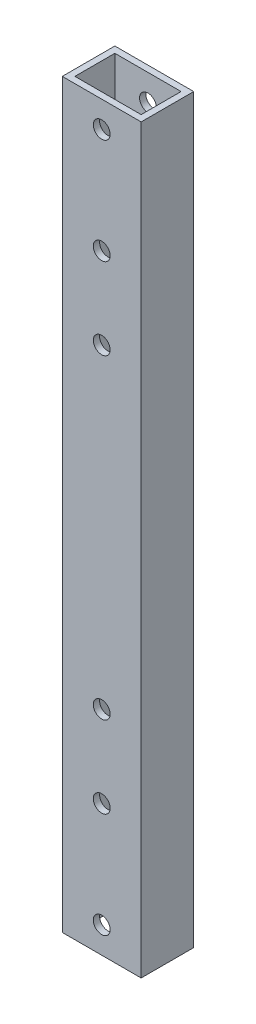
ISO-10303-21;
HEADER;
FILE_DESCRIPTION(('STEP AP214'),'2;1');
FILE_NAME('part.step','',(''),(''),'','','');
FILE_SCHEMA(('AUTOMOTIVE_DESIGN { 1 0 10303 214 1 1 1 1 }'));
ENDSEC;
DATA;
#1=APPLICATION_CONTEXT('core data for automotive mechanical design processes');
#2=APPLICATION_PROTOCOL_DEFINITION('international standard','automotive_design',2000,#1);
#3=PRODUCT_CONTEXT('',#1,'mechanical');
#4=PRODUCT('Part','Part','',(#3));
#5=PRODUCT_RELATED_PRODUCT_CATEGORY('part','',(#4));
#6=PRODUCT_DEFINITION_FORMATION('','',#4);
#7=PRODUCT_DEFINITION_CONTEXT('part definition',#1,'design');
#8=PRODUCT_DEFINITION('design','',#6,#7);
#9=PRODUCT_DEFINITION_SHAPE('','',#8);
#10=(LENGTH_UNIT() NAMED_UNIT(*) SI_UNIT(.MILLI.,.METRE.));
#11=(NAMED_UNIT(*) PLANE_ANGLE_UNIT() SI_UNIT($,.RADIAN.));
#12=(NAMED_UNIT(*) SI_UNIT($,.STERADIAN.) SOLID_ANGLE_UNIT());
#13=UNCERTAINTY_MEASURE_WITH_UNIT(LENGTH_MEASURE(1.E-05),#10,'distance_accuracy_value','');
#14=(GEOMETRIC_REPRESENTATION_CONTEXT(3) GLOBAL_UNCERTAINTY_ASSIGNED_CONTEXT((#13)) GLOBAL_UNIT_ASSIGNED_CONTEXT((#10,
#11,#12)) REPRESENTATION_CONTEXT('',''));
#15=CARTESIAN_POINT('',(0.,0.,0.));
#16=DIRECTION('',(0.,0.,1.));
#17=DIRECTION('',(1.,0.,0.));
#18=AXIS2_PLACEMENT_3D('',#15,#16,#17);
#19=CARTESIAN_POINT('',(0.,70.5,0.));
#20=DIRECTION('',(0.,1.,0.));
#21=DIRECTION('',(0.,0.,1.));
#22=AXIS2_PLACEMENT_3D('',#19,#20,#21);
#23=PLANE('',#22);
#24=DIRECTION('',(0.,0.,-1.));
#25=VECTOR('',#24,1.);
#26=CARTESIAN_POINT('',(7.5,70.5,-5.));
#27=LINE('',#26,#25);
#28=CARTESIAN_POINT('',(7.5,70.5,5.));
#29=VERTEX_POINT('',#28);
#30=CARTESIAN_POINT('',(7.5,70.5,-5.));
#31=VERTEX_POINT('',#30);
#32=EDGE_CURVE('E165',#29,#31,#27,.T.);
#33=ORIENTED_EDGE('',*,*,#32,.T.);
#34=DIRECTION('',(-1.,0.,0.));
#35=VECTOR('',#34,1.);
#36=CARTESIAN_POINT('',(-7.5,70.5,-5.));
#37=LINE('',#36,#35);
#38=CARTESIAN_POINT('',(-7.5,70.5,-5.));
#39=VERTEX_POINT('',#38);
#40=EDGE_CURVE('E169',#31,#39,#37,.T.);
#41=ORIENTED_EDGE('',*,*,#40,.T.);
#42=DIRECTION('',(0.,0.,1.));
#43=VECTOR('',#42,1.);
#44=CARTESIAN_POINT('',(-7.5,70.5,-5.));
#45=LINE('',#44,#43);
#46=CARTESIAN_POINT('',(-7.5,70.5,5.));
#47=VERTEX_POINT('',#46);
#48=EDGE_CURVE('E173',#39,#47,#45,.T.);
#49=ORIENTED_EDGE('',*,*,#48,.T.);
#50=DIRECTION('',(1.,0.,0.));
#51=VECTOR('',#50,1.);
#52=CARTESIAN_POINT('',(-7.5,70.5,5.));
#53=LINE('',#52,#51);
#54=EDGE_CURVE('E176',#47,#29,#53,.T.);
#55=ORIENTED_EDGE('',*,*,#54,.T.);
#56=EDGE_LOOP('',(#33,#41,#49,#55));
#57=FACE_BOUND('',#56,.T.);
#58=DIRECTION('',(1.,0.,0.));
#59=VECTOR('',#58,1.);
#60=CARTESIAN_POINT('',(-6.3,70.5,3.8));
#61=LINE('',#60,#59);
#62=CARTESIAN_POINT('',(-6.3,70.5,3.8));
#63=VERTEX_POINT('',#62);
#64=CARTESIAN_POINT('',(6.3,70.5,3.8));
#65=VERTEX_POINT('',#64);
#66=EDGE_CURVE('E124',#63,#65,#61,.T.);
#67=ORIENTED_EDGE('',*,*,#66,.F.);
#68=DIRECTION('',(0.,0.,1.));
#69=VECTOR('',#68,1.);
#70=CARTESIAN_POINT('',(-6.3,70.5,-3.8));
#71=LINE('',#70,#69);
#72=CARTESIAN_POINT('',(-6.3,70.5,-3.8));
#73=VERTEX_POINT('',#72);
#74=EDGE_CURVE('E115',#73,#63,#71,.T.);
#75=ORIENTED_EDGE('',*,*,#74,.F.);
#76=DIRECTION('',(-1.,0.,0.));
#77=VECTOR('',#76,1.);
#78=CARTESIAN_POINT('',(-6.3,70.5,-3.8));
#79=LINE('',#78,#77);
#80=CARTESIAN_POINT('',(6.3,70.5,-3.8));
#81=VERTEX_POINT('',#80);
#82=EDGE_CURVE('E141',#81,#73,#79,.T.);
#83=ORIENTED_EDGE('',*,*,#82,.F.);
#84=DIRECTION('',(0.,0.,-1.));
#85=VECTOR('',#84,1.);
#86=CARTESIAN_POINT('',(6.3,70.5,-3.8));
#87=LINE('',#86,#85);
#88=EDGE_CURVE('E137',#65,#81,#87,.T.);
#89=ORIENTED_EDGE('',*,*,#88,.F.);
#90=EDGE_LOOP('',(#67,#75,#83,#89));
#91=FACE_BOUND('',#90,.T.);
#92=ADVANCED_FACE('F47',(#57,#91),#23,.T.);
#93=CARTESIAN_POINT('',(0.,-70.5,0.));
#94=DIRECTION('',(0.,1.,0.));
#95=DIRECTION('',(0.,0.,1.));
#96=AXIS2_PLACEMENT_3D('',#93,#94,#95);
#97=PLANE('',#96);
#98=DIRECTION('',(0.,0.,-1.));
#99=VECTOR('',#98,1.);
#100=CARTESIAN_POINT('',(7.5,-70.5,-5.));
#101=LINE('',#100,#99);
#102=CARTESIAN_POINT('',(7.5,-70.5,5.));
#103=VERTEX_POINT('',#102);
#104=CARTESIAN_POINT('',(7.5,-70.5,-5.));
#105=VERTEX_POINT('',#104);
#106=EDGE_CURVE('E133',#103,#105,#101,.T.);
#107=ORIENTED_EDGE('',*,*,#106,.F.);
#108=DIRECTION('',(1.,0.,0.));
#109=VECTOR('',#108,1.);
#110=CARTESIAN_POINT('',(-7.5,-70.5,5.));
#111=LINE('',#110,#109);
#112=CARTESIAN_POINT('',(-7.5,-70.5,5.));
#113=VERTEX_POINT('',#112);
#114=EDGE_CURVE('E170',#113,#103,#111,.T.);
#115=ORIENTED_EDGE('',*,*,#114,.F.);
#116=DIRECTION('',(0.,0.,1.));
#117=VECTOR('',#116,1.);
#118=CARTESIAN_POINT('',(-7.5,-70.5,-5.));
#119=LINE('',#118,#117);
#120=CARTESIAN_POINT('',(-7.5,-70.5,-5.));
#121=VERTEX_POINT('',#120);
#122=EDGE_CURVE('E186',#121,#113,#119,.T.);
#123=ORIENTED_EDGE('',*,*,#122,.F.);
#124=DIRECTION('',(-1.,0.,0.));
#125=VECTOR('',#124,1.);
#126=CARTESIAN_POINT('',(-7.5,-70.5,-5.));
#127=LINE('',#126,#125);
#128=EDGE_CURVE('E183',#105,#121,#127,.T.);
#129=ORIENTED_EDGE('',*,*,#128,.F.);
#130=EDGE_LOOP('',(#107,#115,#123,#129));
#131=FACE_BOUND('',#130,.T.);
#132=DIRECTION('',(0.,0.,1.));
#133=VECTOR('',#132,1.);
#134=CARTESIAN_POINT('',(-6.3,-70.5,-3.8));
#135=LINE('',#134,#133);
#136=CARTESIAN_POINT('',(-6.3,-70.5,-3.8));
#137=VERTEX_POINT('',#136);
#138=CARTESIAN_POINT('',(-6.3,-70.5,3.8));
#139=VERTEX_POINT('',#138);
#140=EDGE_CURVE('E73',#137,#139,#135,.T.);
#141=ORIENTED_EDGE('',*,*,#140,.T.);
#142=DIRECTION('',(1.,0.,0.));
#143=VECTOR('',#142,1.);
#144=CARTESIAN_POINT('',(-6.3,-70.5,3.8));
#145=LINE('',#144,#143);
#146=CARTESIAN_POINT('',(6.3,-70.5,3.8));
#147=VERTEX_POINT('',#146);
#148=EDGE_CURVE('E131',#139,#147,#145,.T.);
#149=ORIENTED_EDGE('',*,*,#148,.T.);
#150=DIRECTION('',(0.,0.,-1.));
#151=VECTOR('',#150,1.);
#152=CARTESIAN_POINT('',(6.3,-70.5,-3.8));
#153=LINE('',#152,#151);
#154=CARTESIAN_POINT('',(6.3,-70.5,-3.8));
#155=VERTEX_POINT('',#154);
#156=EDGE_CURVE('E152',#147,#155,#153,.T.);
#157=ORIENTED_EDGE('',*,*,#156,.T.);
#158=DIRECTION('',(-1.,0.,0.));
#159=VECTOR('',#158,1.);
#160=CARTESIAN_POINT('',(-6.3,-70.5,-3.8));
#161=LINE('',#160,#159);
#162=EDGE_CURVE('E125',#155,#137,#161,.T.);
#163=ORIENTED_EDGE('',*,*,#162,.T.);
#164=EDGE_LOOP('',(#141,#149,#157,#163));
#165=FACE_BOUND('',#164,.T.);
#166=ADVANCED_FACE('F275',(#131,#165),#97,.F.);
#167=CARTESIAN_POINT('',(7.5,70.5,-5.));
#168=DIRECTION('',(-1.,0.,0.));
#169=DIRECTION('',(0.,0.,1.));
#170=AXIS2_PLACEMENT_3D('',#167,#168,#169);
#171=PLANE('',#170);
#172=ORIENTED_EDGE('',*,*,#106,.T.);
#173=DIRECTION('',(0.,-1.,0.));
#174=VECTOR('',#173,1.);
#175=CARTESIAN_POINT('',(7.5,70.5,-5.));
#176=LINE('',#175,#174);
#177=EDGE_CURVE('E11',#31,#105,#176,.T.);
#178=ORIENTED_EDGE('',*,*,#177,.F.);
#179=ORIENTED_EDGE('',*,*,#32,.F.);
#180=DIRECTION('',(0.,-1.,0.));
#181=VECTOR('',#180,1.);
#182=CARTESIAN_POINT('',(7.5,70.5,5.));
#183=LINE('',#182,#181);
#184=EDGE_CURVE('E179',#29,#103,#183,.T.);
#185=ORIENTED_EDGE('',*,*,#184,.T.);
#186=EDGE_LOOP('',(#172,#178,#179,#185));
#187=FACE_BOUND('',#186,.T.);
#188=ADVANCED_FACE('F49',(#187),#171,.F.);
#189=CARTESIAN_POINT('',(-7.5,70.5,-5.));
#190=DIRECTION('',(0.,0.,1.));
#191=DIRECTION('',(1.,0.,0.));
#192=AXIS2_PLACEMENT_3D('',#189,#190,#191);
#193=PLANE('',#192);
#194=CARTESIAN_POINT('',(0.,-65.5,-5.));
#195=DIRECTION('',(0.,0.,-1.));
#196=DIRECTION('',(-1.,0.,0.));
#197=AXIS2_PLACEMENT_3D('',#194,#195,#196);
#198=CIRCLE('',#197,1.60000000000001);
#199=CARTESIAN_POINT('',(-1.60000000000001,-65.5,-5.));
#200=VERTEX_POINT('',#199);
#201=EDGE_CURVE('E206',#200,#200,#198,.T.);
#202=ORIENTED_EDGE('',*,*,#201,.F.);
#203=EDGE_LOOP('',(#202));
#204=FACE_BOUND('',#203,.T.);
#205=CARTESIAN_POINT('',(0.,30.,-5.));
#206=DIRECTION('',(0.,0.,-1.));
#207=DIRECTION('',(1.,0.,0.));
#208=AXIS2_PLACEMENT_3D('',#205,#206,#207);
#209=CIRCLE('',#208,1.6);
#210=CARTESIAN_POINT('',(1.6,30.,-5.));
#211=VERTEX_POINT('',#210);
#212=EDGE_CURVE('E305',#211,#211,#209,.T.);
#213=ORIENTED_EDGE('',*,*,#212,.F.);
#214=EDGE_LOOP('',(#213));
#215=FACE_BOUND('',#214,.T.);
#216=CARTESIAN_POINT('',(0.,-45.5,-5.));
#217=DIRECTION('',(0.,0.,-1.));
#218=DIRECTION('',(-1.,0.,0.));
#219=AXIS2_PLACEMENT_3D('',#216,#217,#218);
#220=CIRCLE('',#219,1.6);
#221=CARTESIAN_POINT('',(-1.6,-45.5,-5.));
#222=VERTEX_POINT('',#221);
#223=EDGE_CURVE('E309',#222,#222,#220,.T.);
#224=ORIENTED_EDGE('',*,*,#223,.F.);
#225=EDGE_LOOP('',(#224));
#226=FACE_BOUND('',#225,.T.);
#227=CARTESIAN_POINT('',(0.,45.5,-5.));
#228=DIRECTION('',(0.,0.,-1.));
#229=DIRECTION('',(1.,0.,0.));
#230=AXIS2_PLACEMENT_3D('',#227,#228,#229);
#231=CIRCLE('',#230,1.6);
#232=CARTESIAN_POINT('',(1.59999999999999,45.5,-5.));
#233=VERTEX_POINT('',#232);
#234=EDGE_CURVE('E313',#233,#233,#231,.T.);
#235=ORIENTED_EDGE('',*,*,#234,.F.);
#236=EDGE_LOOP('',(#235));
#237=FACE_BOUND('',#236,.T.);
#238=CARTESIAN_POINT('',(0.,65.5,-5.));
#239=DIRECTION('',(0.,0.,-1.));
#240=DIRECTION('',(1.,0.,0.));
#241=AXIS2_PLACEMENT_3D('',#238,#239,#240);
#242=CIRCLE('',#241,1.60000000000001);
#243=CARTESIAN_POINT('',(1.6,65.5,-5.));
#244=VERTEX_POINT('',#243);
#245=EDGE_CURVE('E317',#244,#244,#242,.T.);
#246=ORIENTED_EDGE('',*,*,#245,.F.);
#247=EDGE_LOOP('',(#246));
#248=FACE_BOUND('',#247,.T.);
#249=CARTESIAN_POINT('',(0.,-30.,-5.));
#250=DIRECTION('',(0.,0.,-1.));
#251=DIRECTION('',(-1.,0.,0.));
#252=AXIS2_PLACEMENT_3D('',#249,#250,#251);
#253=CIRCLE('',#252,1.6);
#254=CARTESIAN_POINT('',(-1.6,-30.,-5.));
#255=VERTEX_POINT('',#254);
#256=EDGE_CURVE('E321',#255,#255,#253,.T.);
#257=ORIENTED_EDGE('',*,*,#256,.F.);
#258=EDGE_LOOP('',(#257));
#259=FACE_BOUND('',#258,.T.);
#260=ORIENTED_EDGE('',*,*,#128,.T.);
#261=DIRECTION('',(0.,-1.,0.));
#262=VECTOR('',#261,1.);
#263=CARTESIAN_POINT('',(-7.5,70.5,-5.));
#264=LINE('',#263,#262);
#265=EDGE_CURVE('E57',#39,#121,#264,.T.);
#266=ORIENTED_EDGE('',*,*,#265,.F.);
#267=ORIENTED_EDGE('',*,*,#40,.F.);
#268=ORIENTED_EDGE('',*,*,#177,.T.);
#269=EDGE_LOOP('',(#260,#266,#267,#268));
#270=FACE_BOUND('',#269,.T.);
#271=ADVANCED_FACE('F290',(#204,#215,#226,#237,#248,#259,#270),#193,.F.);
#272=CARTESIAN_POINT('',(-7.5,70.5,-5.));
#273=DIRECTION('',(1.,0.,0.));
#274=DIRECTION('',(0.,0.,-1.));
#275=AXIS2_PLACEMENT_3D('',#272,#273,#274);
#276=PLANE('',#275);
#277=ORIENTED_EDGE('',*,*,#122,.T.);
#278=DIRECTION('',(0.,-1.,0.));
#279=VECTOR('',#278,1.);
#280=CARTESIAN_POINT('',(-7.5,70.5,5.));
#281=LINE('',#280,#279);
#282=EDGE_CURVE('E194',#47,#113,#281,.T.);
#283=ORIENTED_EDGE('',*,*,#282,.F.);
#284=ORIENTED_EDGE('',*,*,#48,.F.);
#285=ORIENTED_EDGE('',*,*,#265,.T.);
#286=EDGE_LOOP('',(#277,#283,#284,#285));
#287=FACE_BOUND('',#286,.T.);
#288=ADVANCED_FACE('F288',(#287),#276,.F.);
#289=CARTESIAN_POINT('',(-7.5,70.5,5.));
#290=DIRECTION('',(0.,0.,-1.));
#291=DIRECTION('',(-1.,0.,0.));
#292=AXIS2_PLACEMENT_3D('',#289,#290,#291);
#293=PLANE('',#292);
#294=CARTESIAN_POINT('',(0.,-65.5,5.));
#295=DIRECTION('',(0.,0.,-1.));
#296=DIRECTION('',(-1.,0.,0.));
#297=AXIS2_PLACEMENT_3D('',#294,#295,#296);
#298=CIRCLE('',#297,1.60000000000001);
#299=CARTESIAN_POINT('',(-1.60000000000001,-65.5,5.));
#300=VERTEX_POINT('',#299);
#301=EDGE_CURVE('E149',#300,#300,#298,.T.);
#302=ORIENTED_EDGE('',*,*,#301,.T.);
#303=EDGE_LOOP('',(#302));
#304=FACE_BOUND('',#303,.T.);
#305=CARTESIAN_POINT('',(0.,30.,5.));
#306=DIRECTION('',(0.,0.,-1.));
#307=DIRECTION('',(-1.,0.,0.));
#308=AXIS2_PLACEMENT_3D('',#305,#306,#307);
#309=CIRCLE('',#308,1.6);
#310=CARTESIAN_POINT('',(-1.6,30.,5.));
#311=VERTEX_POINT('',#310);
#312=EDGE_CURVE('E234',#311,#311,#309,.T.);
#313=ORIENTED_EDGE('',*,*,#312,.T.);
#314=EDGE_LOOP('',(#313));
#315=FACE_BOUND('',#314,.T.);
#316=CARTESIAN_POINT('',(0.,-45.5,5.));
#317=DIRECTION('',(0.,0.,-1.));
#318=DIRECTION('',(-1.,0.,0.));
#319=AXIS2_PLACEMENT_3D('',#316,#317,#318);
#320=CIRCLE('',#319,1.6);
#321=CARTESIAN_POINT('',(-1.6,-45.5,5.));
#322=VERTEX_POINT('',#321);
#323=EDGE_CURVE('E228',#322,#322,#320,.T.);
#324=ORIENTED_EDGE('',*,*,#323,.T.);
#325=EDGE_LOOP('',(#324));
#326=FACE_BOUND('',#325,.T.);
#327=CARTESIAN_POINT('',(0.,45.5,5.));
#328=DIRECTION('',(0.,0.,-1.));
#329=DIRECTION('',(-1.,0.,0.));
#330=AXIS2_PLACEMENT_3D('',#327,#328,#329);
#331=CIRCLE('',#330,1.6);
#332=CARTESIAN_POINT('',(-1.6,45.5,5.));
#333=VERTEX_POINT('',#332);
#334=EDGE_CURVE('E223',#333,#333,#331,.T.);
#335=ORIENTED_EDGE('',*,*,#334,.T.);
#336=EDGE_LOOP('',(#335));
#337=FACE_BOUND('',#336,.T.);
#338=CARTESIAN_POINT('',(0.,65.5,5.));
#339=DIRECTION('',(0.,0.,-1.));
#340=DIRECTION('',(-1.,0.,0.));
#341=AXIS2_PLACEMENT_3D('',#338,#339,#340);
#342=CIRCLE('',#341,1.60000000000001);
#343=CARTESIAN_POINT('',(-1.60000000000001,65.5,5.));
#344=VERTEX_POINT('',#343);
#345=EDGE_CURVE('E218',#344,#344,#342,.T.);
#346=ORIENTED_EDGE('',*,*,#345,.T.);
#347=EDGE_LOOP('',(#346));
#348=FACE_BOUND('',#347,.T.);
#349=CARTESIAN_POINT('',(0.,-30.,5.));
#350=DIRECTION('',(0.,0.,-1.));
#351=DIRECTION('',(-1.,0.,0.));
#352=AXIS2_PLACEMENT_3D('',#349,#350,#351);
#353=CIRCLE('',#352,1.6);
#354=CARTESIAN_POINT('',(-1.6,-30.,5.));
#355=VERTEX_POINT('',#354);
#356=EDGE_CURVE('E212',#355,#355,#353,.T.);
#357=ORIENTED_EDGE('',*,*,#356,.T.);
#358=EDGE_LOOP('',(#357));
#359=FACE_BOUND('',#358,.T.);
#360=ORIENTED_EDGE('',*,*,#114,.T.);
#361=ORIENTED_EDGE('',*,*,#184,.F.);
#362=ORIENTED_EDGE('',*,*,#54,.F.);
#363=ORIENTED_EDGE('',*,*,#282,.T.);
#364=EDGE_LOOP('',(#360,#361,#362,#363));
#365=FACE_BOUND('',#364,.T.);
#366=ADVANCED_FACE('F255',(#304,#315,#326,#337,#348,#359,#365),#293,.F.);
#367=CARTESIAN_POINT('',(-6.3,70.5,-3.8));
#368=DIRECTION('',(1.,0.,0.));
#369=DIRECTION('',(0.,0.,-1.));
#370=AXIS2_PLACEMENT_3D('',#367,#368,#369);
#371=PLANE('',#370);
#372=ORIENTED_EDGE('',*,*,#140,.F.);
#373=DIRECTION('',(0.,-1.,0.));
#374=VECTOR('',#373,1.);
#375=CARTESIAN_POINT('',(-6.3,70.5,-3.8));
#376=LINE('',#375,#374);
#377=EDGE_CURVE('E119',#73,#137,#376,.T.);
#378=ORIENTED_EDGE('',*,*,#377,.F.);
#379=ORIENTED_EDGE('',*,*,#74,.T.);
#380=DIRECTION('',(0.,-1.,0.));
#381=VECTOR('',#380,1.);
#382=CARTESIAN_POINT('',(-6.3,70.5,3.8));
#383=LINE('',#382,#381);
#384=EDGE_CURVE('E118',#63,#139,#383,.T.);
#385=ORIENTED_EDGE('',*,*,#384,.T.);
#386=EDGE_LOOP('',(#372,#378,#379,#385));
#387=FACE_BOUND('',#386,.T.);
#388=ADVANCED_FACE('F117',(#387),#371,.T.);
#389=CARTESIAN_POINT('',(-6.3,70.5,3.8));
#390=DIRECTION('',(0.,0.,-1.));
#391=DIRECTION('',(-1.,0.,0.));
#392=AXIS2_PLACEMENT_3D('',#389,#390,#391);
#393=PLANE('',#392);
#394=CARTESIAN_POINT('',(0.,-65.5,3.8));
#395=DIRECTION('',(0.,0.,-1.));
#396=DIRECTION('',(-1.,0.,0.));
#397=AXIS2_PLACEMENT_3D('',#394,#395,#396);
#398=CIRCLE('',#397,1.60000000000001);
#399=CARTESIAN_POINT('',(-1.60000000000001,-65.5,3.8));
#400=VERTEX_POINT('',#399);
#401=EDGE_CURVE('E248',#400,#400,#398,.T.);
#402=ORIENTED_EDGE('',*,*,#401,.F.);
#403=EDGE_LOOP('',(#402));
#404=FACE_BOUND('',#403,.T.);
#405=CARTESIAN_POINT('',(0.,30.,3.8));
#406=DIRECTION('',(0.,0.,-1.));
#407=DIRECTION('',(-1.,0.,0.));
#408=AXIS2_PLACEMENT_3D('',#405,#406,#407);
#409=CIRCLE('',#408,1.6);
#410=CARTESIAN_POINT('',(-1.6,30.,3.8));
#411=VERTEX_POINT('',#410);
#412=EDGE_CURVE('E227',#411,#411,#409,.T.);
#413=ORIENTED_EDGE('',*,*,#412,.F.);
#414=EDGE_LOOP('',(#413));
#415=FACE_BOUND('',#414,.T.);
#416=CARTESIAN_POINT('',(0.,-45.5,3.8));
#417=DIRECTION('',(0.,0.,-1.));
#418=DIRECTION('',(-1.,0.,0.));
#419=AXIS2_PLACEMENT_3D('',#416,#417,#418);
#420=CIRCLE('',#419,1.6);
#421=CARTESIAN_POINT('',(-1.6,-45.5,3.8));
#422=VERTEX_POINT('',#421);
#423=EDGE_CURVE('E222',#422,#422,#420,.T.);
#424=ORIENTED_EDGE('',*,*,#423,.F.);
#425=EDGE_LOOP('',(#424));
#426=FACE_BOUND('',#425,.T.);
#427=CARTESIAN_POINT('',(0.,45.5,3.8));
#428=DIRECTION('',(0.,0.,-1.));
#429=DIRECTION('',(-1.,0.,0.));
#430=AXIS2_PLACEMENT_3D('',#427,#428,#429);
#431=CIRCLE('',#430,1.6);
#432=CARTESIAN_POINT('',(-1.6,45.5,3.8));
#433=VERTEX_POINT('',#432);
#434=EDGE_CURVE('E217',#433,#433,#431,.T.);
#435=ORIENTED_EDGE('',*,*,#434,.F.);
#436=EDGE_LOOP('',(#435));
#437=FACE_BOUND('',#436,.T.);
#438=CARTESIAN_POINT('',(0.,65.5,3.8));
#439=DIRECTION('',(0.,0.,-1.));
#440=DIRECTION('',(-1.,0.,0.));
#441=AXIS2_PLACEMENT_3D('',#438,#439,#440);
#442=CIRCLE('',#441,1.60000000000001);
#443=CARTESIAN_POINT('',(-1.60000000000001,65.5,3.8));
#444=VERTEX_POINT('',#443);
#445=EDGE_CURVE('E211',#444,#444,#442,.T.);
#446=ORIENTED_EDGE('',*,*,#445,.F.);
#447=EDGE_LOOP('',(#446));
#448=FACE_BOUND('',#447,.T.);
#449=CARTESIAN_POINT('',(0.,-30.,3.8));
#450=DIRECTION('',(0.,0.,-1.));
#451=DIRECTION('',(-1.,0.,0.));
#452=AXIS2_PLACEMENT_3D('',#449,#450,#451);
#453=CIRCLE('',#452,1.6);
#454=CARTESIAN_POINT('',(-1.6,-30.,3.8));
#455=VERTEX_POINT('',#454);
#456=EDGE_CURVE('E205',#455,#455,#453,.T.);
#457=ORIENTED_EDGE('',*,*,#456,.F.);
#458=EDGE_LOOP('',(#457));
#459=FACE_BOUND('',#458,.T.);
#460=ORIENTED_EDGE('',*,*,#148,.F.);
#461=ORIENTED_EDGE('',*,*,#384,.F.);
#462=ORIENTED_EDGE('',*,*,#66,.T.);
#463=DIRECTION('',(0.,-1.,0.));
#464=VECTOR('',#463,1.);
#465=CARTESIAN_POINT('',(6.3,70.5,3.8));
#466=LINE('',#465,#464);
#467=EDGE_CURVE('E134',#65,#147,#466,.T.);
#468=ORIENTED_EDGE('',*,*,#467,.T.);
#469=EDGE_LOOP('',(#460,#461,#462,#468));
#470=FACE_BOUND('',#469,.T.);
#471=ADVANCED_FACE('F128',(#404,#415,#426,#437,#448,#459,#470),#393,.T.);
#472=CARTESIAN_POINT('',(6.3,70.5,-3.8));
#473=DIRECTION('',(-1.,0.,0.));
#474=DIRECTION('',(0.,0.,1.));
#475=AXIS2_PLACEMENT_3D('',#472,#473,#474);
#476=PLANE('',#475);
#477=ORIENTED_EDGE('',*,*,#156,.F.);
#478=ORIENTED_EDGE('',*,*,#467,.F.);
#479=ORIENTED_EDGE('',*,*,#88,.T.);
#480=DIRECTION('',(0.,-1.,0.));
#481=VECTOR('',#480,1.);
#482=CARTESIAN_POINT('',(6.3,70.5,-3.8));
#483=LINE('',#482,#481);
#484=EDGE_CURVE('E65',#81,#155,#483,.T.);
#485=ORIENTED_EDGE('',*,*,#484,.T.);
#486=EDGE_LOOP('',(#477,#478,#479,#485));
#487=FACE_BOUND('',#486,.T.);
#488=ADVANCED_FACE('F338',(#487),#476,.T.);
#489=CARTESIAN_POINT('',(-6.3,70.5,-3.8));
#490=DIRECTION('',(0.,0.,1.));
#491=DIRECTION('',(1.,0.,0.));
#492=AXIS2_PLACEMENT_3D('',#489,#490,#491);
#493=PLANE('',#492);
#494=CARTESIAN_POINT('',(0.,-65.5,-3.8));
#495=DIRECTION('',(0.,0.,1.));
#496=DIRECTION('',(1.,0.,0.));
#497=AXIS2_PLACEMENT_3D('',#494,#495,#496);
#498=CIRCLE('',#497,1.60000000000001);
#499=CARTESIAN_POINT('',(1.6,-65.5,-3.8));
#500=VERTEX_POINT('',#499);
#501=EDGE_CURVE('E51',#500,#500,#498,.T.);
#502=ORIENTED_EDGE('',*,*,#501,.F.);
#503=EDGE_LOOP('',(#502));
#504=FACE_BOUND('',#503,.T.);
#505=CARTESIAN_POINT('',(0.,30.,-3.8));
#506=DIRECTION('',(0.,0.,1.));
#507=DIRECTION('',(1.,0.,0.));
#508=AXIS2_PLACEMENT_3D('',#505,#506,#507);
#509=CIRCLE('',#508,1.6);
#510=CARTESIAN_POINT('',(1.6,30.,-3.8));
#511=VERTEX_POINT('',#510);
#512=EDGE_CURVE('E224',#511,#511,#509,.T.);
#513=ORIENTED_EDGE('',*,*,#512,.F.);
#514=EDGE_LOOP('',(#513));
#515=FACE_BOUND('',#514,.T.);
#516=CARTESIAN_POINT('',(0.,-45.5,-3.8));
#517=DIRECTION('',(0.,0.,1.));
#518=DIRECTION('',(1.,0.,0.));
#519=AXIS2_PLACEMENT_3D('',#516,#517,#518);
#520=CIRCLE('',#519,1.6);
#521=CARTESIAN_POINT('',(1.59999999999999,-45.5,-3.8));
#522=VERTEX_POINT('',#521);
#523=EDGE_CURVE('E219',#522,#522,#520,.T.);
#524=ORIENTED_EDGE('',*,*,#523,.F.);
#525=EDGE_LOOP('',(#524));
#526=FACE_BOUND('',#525,.T.);
#527=CARTESIAN_POINT('',(0.,45.5,-3.8));
#528=DIRECTION('',(0.,0.,1.));
#529=DIRECTION('',(1.,0.,0.));
#530=AXIS2_PLACEMENT_3D('',#527,#528,#529);
#531=CIRCLE('',#530,1.6);
#532=CARTESIAN_POINT('',(1.59999999999999,45.5,-3.8));
#533=VERTEX_POINT('',#532);
#534=EDGE_CURVE('E213',#533,#533,#531,.T.);
#535=ORIENTED_EDGE('',*,*,#534,.F.);
#536=EDGE_LOOP('',(#535));
#537=FACE_BOUND('',#536,.T.);
#538=CARTESIAN_POINT('',(0.,65.5,-3.8));
#539=DIRECTION('',(0.,0.,1.));
#540=DIRECTION('',(1.,0.,0.));
#541=AXIS2_PLACEMENT_3D('',#538,#539,#540);
#542=CIRCLE('',#541,1.60000000000001);
#543=CARTESIAN_POINT('',(1.6,65.5,-3.8));
#544=VERTEX_POINT('',#543);
#545=EDGE_CURVE('E207',#544,#544,#542,.T.);
#546=ORIENTED_EDGE('',*,*,#545,.F.);
#547=EDGE_LOOP('',(#546));
#548=FACE_BOUND('',#547,.T.);
#549=CARTESIAN_POINT('',(0.,-30.,-3.8));
#550=DIRECTION('',(0.,0.,1.));
#551=DIRECTION('',(1.,0.,0.));
#552=AXIS2_PLACEMENT_3D('',#549,#550,#551);
#553=CIRCLE('',#552,1.6);
#554=CARTESIAN_POINT('',(1.6,-30.,-3.8));
#555=VERTEX_POINT('',#554);
#556=EDGE_CURVE('E201',#555,#555,#553,.T.);
#557=ORIENTED_EDGE('',*,*,#556,.F.);
#558=EDGE_LOOP('',(#557));
#559=FACE_BOUND('',#558,.T.);
#560=ORIENTED_EDGE('',*,*,#162,.F.);
#561=ORIENTED_EDGE('',*,*,#484,.F.);
#562=ORIENTED_EDGE('',*,*,#82,.T.);
#563=ORIENTED_EDGE('',*,*,#377,.T.);
#564=EDGE_LOOP('',(#560,#561,#562,#563));
#565=FACE_BOUND('',#564,.T.);
#566=ADVANCED_FACE('F335',(#504,#515,#526,#537,#548,#559,#565),#493,.T.);
#567=CARTESIAN_POINT('',(0.,-30.,95.));
#568=DIRECTION('',(0.,0.,-1.));
#569=DIRECTION('',(-1.,0.,0.));
#570=AXIS2_PLACEMENT_3D('',#567,#568,#569);
#571=CYLINDRICAL_SURFACE('',#570,1.6);
#572=ORIENTED_EDGE('',*,*,#556,.T.);
#573=EDGE_LOOP('',(#572));
#574=FACE_BOUND('',#573,.T.);
#575=ORIENTED_EDGE('',*,*,#256,.T.);
#576=EDGE_LOOP('',(#575));
#577=FACE_BOUND('',#576,.T.);
#578=ADVANCED_FACE('F337',(#574,#577),#571,.F.);
#579=CARTESIAN_POINT('',(0.,65.5,95.));
#580=DIRECTION('',(0.,0.,-1.));
#581=DIRECTION('',(-1.,0.,0.));
#582=AXIS2_PLACEMENT_3D('',#579,#580,#581);
#583=CYLINDRICAL_SURFACE('',#582,1.60000000000001);
#584=ORIENTED_EDGE('',*,*,#545,.T.);
#585=EDGE_LOOP('',(#584));
#586=FACE_BOUND('',#585,.T.);
#587=ORIENTED_EDGE('',*,*,#245,.T.);
#588=EDGE_LOOP('',(#587));
#589=FACE_BOUND('',#588,.T.);
#590=ADVANCED_FACE('F345',(#586,#589),#583,.F.);
#591=CARTESIAN_POINT('',(0.,45.5,95.));
#592=DIRECTION('',(0.,0.,-1.));
#593=DIRECTION('',(-1.,0.,0.));
#594=AXIS2_PLACEMENT_3D('',#591,#592,#593);
#595=CYLINDRICAL_SURFACE('',#594,1.6);
#596=ORIENTED_EDGE('',*,*,#534,.T.);
#597=EDGE_LOOP('',(#596));
#598=FACE_BOUND('',#597,.T.);
#599=ORIENTED_EDGE('',*,*,#234,.T.);
#600=EDGE_LOOP('',(#599));
#601=FACE_BOUND('',#600,.T.);
#602=ADVANCED_FACE('F353',(#598,#601),#595,.F.);
#603=CARTESIAN_POINT('',(0.,-45.5,95.));
#604=DIRECTION('',(0.,0.,-1.));
#605=DIRECTION('',(-1.,0.,0.));
#606=AXIS2_PLACEMENT_3D('',#603,#604,#605);
#607=CYLINDRICAL_SURFACE('',#606,1.6);
#608=ORIENTED_EDGE('',*,*,#523,.T.);
#609=EDGE_LOOP('',(#608));
#610=FACE_BOUND('',#609,.T.);
#611=ORIENTED_EDGE('',*,*,#223,.T.);
#612=EDGE_LOOP('',(#611));
#613=FACE_BOUND('',#612,.T.);
#614=ADVANCED_FACE('F403',(#610,#613),#607,.F.);
#615=CARTESIAN_POINT('',(0.,30.,95.));
#616=DIRECTION('',(0.,0.,-1.));
#617=DIRECTION('',(-1.,0.,0.));
#618=AXIS2_PLACEMENT_3D('',#615,#616,#617);
#619=CYLINDRICAL_SURFACE('',#618,1.6);
#620=ORIENTED_EDGE('',*,*,#512,.T.);
#621=EDGE_LOOP('',(#620));
#622=FACE_BOUND('',#621,.T.);
#623=ORIENTED_EDGE('',*,*,#212,.T.);
#624=EDGE_LOOP('',(#623));
#625=FACE_BOUND('',#624,.T.);
#626=ADVANCED_FACE('F270',(#622,#625),#619,.F.);
#627=CARTESIAN_POINT('',(0.,-65.5,95.));
#628=DIRECTION('',(0.,0.,-1.));
#629=DIRECTION('',(-1.,0.,0.));
#630=AXIS2_PLACEMENT_3D('',#627,#628,#629);
#631=CYLINDRICAL_SURFACE('',#630,1.60000000000001);
#632=ORIENTED_EDGE('',*,*,#501,.T.);
#633=EDGE_LOOP('',(#632));
#634=FACE_BOUND('',#633,.T.);
#635=ORIENTED_EDGE('',*,*,#201,.T.);
#636=EDGE_LOOP('',(#635));
#637=FACE_BOUND('',#636,.T.);
#638=ADVANCED_FACE('F263',(#634,#637),#631,.F.);
#639=ORIENTED_EDGE('',*,*,#456,.T.);
#640=EDGE_LOOP('',(#639));
#641=FACE_BOUND('',#640,.T.);
#642=ORIENTED_EDGE('',*,*,#356,.F.);
#643=EDGE_LOOP('',(#642));
#644=FACE_BOUND('',#643,.T.);
#645=ADVANCED_FACE('F272',(#641,#644),#571,.F.);
#646=ORIENTED_EDGE('',*,*,#445,.T.);
#647=EDGE_LOOP('',(#646));
#648=FACE_BOUND('',#647,.T.);
#649=ORIENTED_EDGE('',*,*,#345,.F.);
#650=EDGE_LOOP('',(#649));
#651=FACE_BOUND('',#650,.T.);
#652=ADVANCED_FACE('F396',(#648,#651),#583,.F.);
#653=ORIENTED_EDGE('',*,*,#434,.T.);
#654=EDGE_LOOP('',(#653));
#655=FACE_BOUND('',#654,.T.);
#656=ORIENTED_EDGE('',*,*,#334,.F.);
#657=EDGE_LOOP('',(#656));
#658=FACE_BOUND('',#657,.T.);
#659=ADVANCED_FACE('F394',(#655,#658),#595,.F.);
#660=ORIENTED_EDGE('',*,*,#423,.T.);
#661=EDGE_LOOP('',(#660));
#662=FACE_BOUND('',#661,.T.);
#663=ORIENTED_EDGE('',*,*,#323,.F.);
#664=EDGE_LOOP('',(#663));
#665=FACE_BOUND('',#664,.T.);
#666=ADVANCED_FACE('F267',(#662,#665),#607,.F.);
#667=ORIENTED_EDGE('',*,*,#412,.T.);
#668=EDGE_LOOP('',(#667));
#669=FACE_BOUND('',#668,.T.);
#670=ORIENTED_EDGE('',*,*,#312,.F.);
#671=EDGE_LOOP('',(#670));
#672=FACE_BOUND('',#671,.T.);
#673=ADVANCED_FACE('F260',(#669,#672),#619,.F.);
#674=ORIENTED_EDGE('',*,*,#401,.T.);
#675=EDGE_LOOP('',(#674));
#676=FACE_BOUND('',#675,.T.);
#677=ORIENTED_EDGE('',*,*,#301,.F.);
#678=EDGE_LOOP('',(#677));
#679=FACE_BOUND('',#678,.T.);
#680=ADVANCED_FACE('F258',(#676,#679),#631,.F.);
#681=CLOSED_SHELL('',(#92,#166,#188,#271,#288,#366,#388,#471,#488,#566,#578,#590,#602,#614,#626,
#638,#645,#652,#659,#666,#673,#680));
#682=MANIFOLD_SOLID_BREP('B2',#681);
#683=ADVANCED_BREP_SHAPE_REPRESENTATION('',(#18,#682),#14);
#684=SHAPE_DEFINITION_REPRESENTATION(#9,#683);
ENDSEC;
END-ISO-10303-21;
